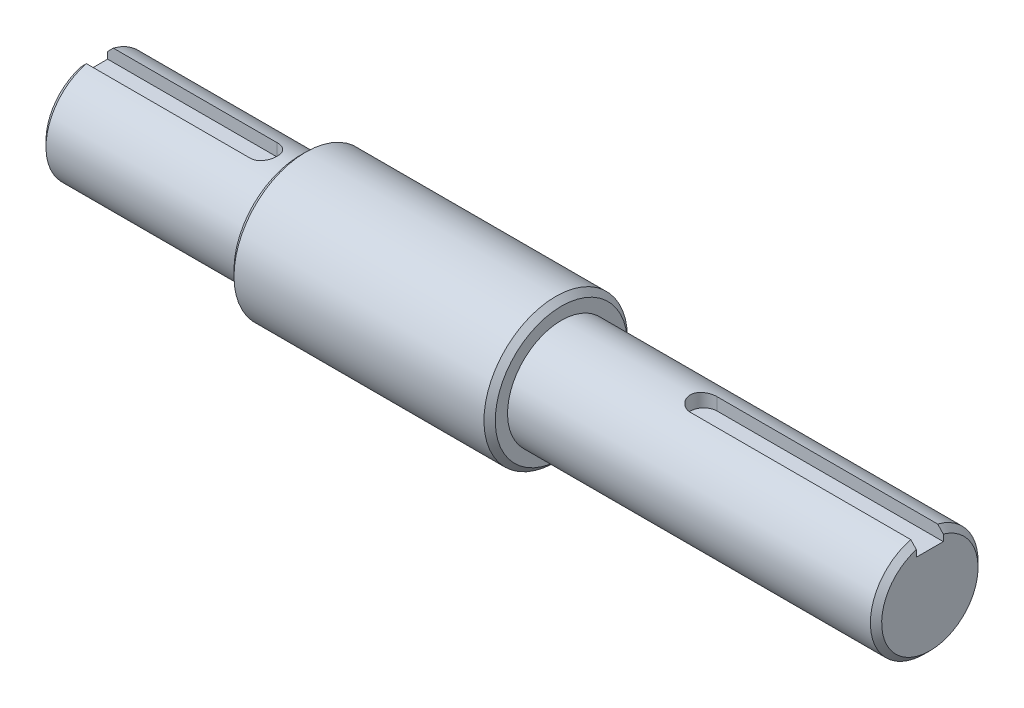
ISO-10303-21;
HEADER;
FILE_DESCRIPTION(('STEP AP214'),'2;1');
FILE_NAME('part.step','',(''),(''),'','','');
FILE_SCHEMA(('AUTOMOTIVE_DESIGN { 1 0 10303 214 1 1 1 1 }'));
ENDSEC;
DATA;
#1=APPLICATION_CONTEXT('core data for automotive mechanical design processes');
#2=APPLICATION_PROTOCOL_DEFINITION('international standard','automotive_design',2000,#1);
#3=PRODUCT_CONTEXT('',#1,'mechanical');
#4=PRODUCT('Part','Part','',(#3));
#5=PRODUCT_RELATED_PRODUCT_CATEGORY('part','',(#4));
#6=PRODUCT_DEFINITION_FORMATION('','',#4);
#7=PRODUCT_DEFINITION_CONTEXT('part definition',#1,'design');
#8=PRODUCT_DEFINITION('design','',#6,#7);
#9=PRODUCT_DEFINITION_SHAPE('','',#8);
#10=(LENGTH_UNIT() NAMED_UNIT(*) SI_UNIT(.MILLI.,.METRE.));
#11=(NAMED_UNIT(*) PLANE_ANGLE_UNIT() SI_UNIT($,.RADIAN.));
#12=(NAMED_UNIT(*) SI_UNIT($,.STERADIAN.) SOLID_ANGLE_UNIT());
#13=UNCERTAINTY_MEASURE_WITH_UNIT(LENGTH_MEASURE(1.E-05),#10,'distance_accuracy_value','');
#14=(GEOMETRIC_REPRESENTATION_CONTEXT(3) GLOBAL_UNCERTAINTY_ASSIGNED_CONTEXT((#13)) GLOBAL_UNIT_ASSIGNED_CONTEXT((#10,
#11,#12)) REPRESENTATION_CONTEXT('',''));
#15=CARTESIAN_POINT('',(0.,0.,0.));
#16=DIRECTION('',(0.,0.,1.));
#17=DIRECTION('',(1.,0.,0.));
#18=AXIS2_PLACEMENT_3D('',#15,#16,#17);
#19=CARTESIAN_POINT('',(-59.557840342124,-12.7,0.));
#20=DIRECTION('',(-1.,0.,0.));
#21=DIRECTION('',(0.,-1.,0.));
#22=AXIS2_PLACEMENT_3D('',#19,#20,#21);
#23=PLANE('',#22);
#24=DIRECTION('',(0.,1.,0.));
#25=VECTOR('',#24,1.);
#26=CARTESIAN_POINT('',(-59.557840342124,-5.67500000000002,-2.38125));
#27=LINE('',#26,#25);
#28=CARTESIAN_POINT('',(-59.557840342124,-5.67500000000002,-2.38125));
#29=VERTEX_POINT('',#28);
#30=CARTESIAN_POINT('',(-59.557840342124,-4.51432510800122,-2.38125));
#31=VERTEX_POINT('',#30);
#32=EDGE_CURVE('E114',#29,#31,#27,.T.);
#33=ORIENTED_EDGE('',*,*,#32,.T.);
#34=CARTESIAN_POINT('',(-59.557840342124,-12.7,0.));
#35=DIRECTION('',(-1.,0.,0.));
#36=DIRECTION('',(0.,-1.,0.));
#37=AXIS2_PLACEMENT_3D('',#34,#35,#36);
#38=CIRCLE('',#37,8.52499999999996);
#39=CARTESIAN_POINT('',(-59.557840342124,-4.51432510800121,2.38125));
#40=VERTEX_POINT('',#39);
#41=EDGE_CURVE('E165',#31,#40,#38,.T.);
#42=ORIENTED_EDGE('',*,*,#41,.T.);
#43=DIRECTION('',(0.,1.,0.));
#44=VECTOR('',#43,1.);
#45=CARTESIAN_POINT('',(-59.557840342124,-5.67500000000002,2.38125));
#46=LINE('',#45,#44);
#47=CARTESIAN_POINT('',(-59.557840342124,-5.67500000000002,2.38125));
#48=VERTEX_POINT('',#47);
#49=EDGE_CURVE('E135',#48,#40,#46,.T.);
#50=ORIENTED_EDGE('',*,*,#49,.F.);
#51=DIRECTION('',(0.,0.,-1.));
#52=VECTOR('',#51,1.);
#53=CARTESIAN_POINT('',(-59.557840342124,-5.67500000000002,0.));
#54=LINE('',#53,#52);
#55=EDGE_CURVE('E131',#48,#29,#54,.T.);
#56=ORIENTED_EDGE('',*,*,#55,.T.);
#57=EDGE_LOOP('',(#33,#42,#50,#56));
#58=FACE_BOUND('',#57,.T.);
#59=ADVANCED_FACE('F33',(#58),#23,.T.);
#60=CARTESIAN_POINT('',(88.3114350212544,-12.7,0.));
#61=DIRECTION('',(1.,0.,0.));
#62=DIRECTION('',(0.,1.,0.));
#63=AXIS2_PLACEMENT_3D('',#60,#61,#62);
#64=CYLINDRICAL_SURFACE('',#63,9.52499999999998);
#65=DIRECTION('',(1.,0.,0.));
#66=VECTOR('',#65,1.);
#67=CARTESIAN_POINT('',(88.3114350212544,-3.4774584068436,2.38125));
#68=LINE('',#67,#66);
#69=CARTESIAN_POINT('',(-58.557840342124,-3.4774584068436,2.38125));
#70=VERTEX_POINT('',#69);
#71=CARTESIAN_POINT('',(-29.557840342124,-3.4774584068436,2.38125));
#72=VERTEX_POINT('',#71);
#73=EDGE_CURVE('E140',#70,#72,#68,.T.);
#74=ORIENTED_EDGE('',*,*,#73,.F.);
#75=CARTESIAN_POINT('',(-58.557840342124,-12.7,0.));
#76=DIRECTION('',(-1.,0.,0.));
#77=DIRECTION('',(0.,0.,1.));
#78=AXIS2_PLACEMENT_3D('',#75,#76,#77);
#79=CIRCLE('',#78,9.52499999999998);
#80=CARTESIAN_POINT('',(-58.557840342124,-3.4774584068436,-2.38125));
#81=VERTEX_POINT('',#80);
#82=EDGE_CURVE('E157',#70,#81,#79,.F.);
#83=ORIENTED_EDGE('',*,*,#82,.T.);
#84=DIRECTION('',(1.,0.,0.));
#85=VECTOR('',#84,1.);
#86=CARTESIAN_POINT('',(88.3114350212544,-3.4774584068436,-2.38125));
#87=LINE('',#86,#85);
#88=CARTESIAN_POINT('',(-29.557840342124,-3.4774584068436,-2.38125));
#89=VERTEX_POINT('',#88);
#90=EDGE_CURVE('E145',#81,#89,#87,.T.);
#91=ORIENTED_EDGE('',*,*,#90,.T.);
#92=CARTESIAN_POINT('',(-29.557840342124,-3.4774584068436,2.38125));
#93=CARTESIAN_POINT('',(-29.491986601769,-3.47746576437919,2.38125762891168));
#94=CARTESIAN_POINT('',(-29.4261373864884,-3.47675322667741,2.37851832615));
#95=CARTESIAN_POINT('',(-29.2949313639576,-3.47394292920292,2.36760511039788));
#96=CARTESIAN_POINT('',(-29.2295744757209,-3.47184540252273,2.35943211189247));
#97=CARTESIAN_POINT('',(-29.0999421614342,-3.4663251195822,2.33773217686751));
#98=CARTESIAN_POINT('',(-29.0356648539693,-3.4629049895767,2.32421584926354));
#99=CARTESIAN_POINT('',(-28.9085317503035,-3.45484761726507,2.29195478238902));
#100=CARTESIAN_POINT('',(-28.845675973664,-3.45021035822123,2.27320997121717));
#101=CARTESIAN_POINT('',(-28.6599089898805,-3.43466702613892,2.20933850925812));
#102=CARTESIAN_POINT('',(-28.5396678961512,-3.42212344311182,2.15655282913113));
#103=CARTESIAN_POINT('',(-28.3097739965468,-3.3940951338733,2.03219018131674));
#104=CARTESIAN_POINT('',(-28.2001240407313,-3.37860961930008,1.96060817472903));
#105=CARTESIAN_POINT('',(-27.9920711302829,-3.3460628830254,1.79899882880256));
#106=CARTESIAN_POINT('',(-27.8939321879695,-3.32897663634539,1.70863600473308));
#107=CARTESIAN_POINT('',(-27.7140315725193,-3.29536966633859,1.5127500688518));
#108=CARTESIAN_POINT('',(-27.6322725172281,-3.27884903375793,1.40722453834541));
#109=CARTESIAN_POINT('',(-27.4863652942111,-3.2479571690118,1.18218809655591));
#110=CARTESIAN_POINT('',(-27.4224786052936,-3.2336191223451,1.06250268224561));
#111=CARTESIAN_POINT('',(-27.3158344283644,-3.20899600232959,0.813679266376078));
#112=CARTESIAN_POINT('',(-27.2730727819852,-3.19871013140945,0.684543130898577));
#113=CARTESIAN_POINT('',(-27.2107399020929,-3.18352725679829,0.423253165723822));
#114=CARTESIAN_POINT('',(-27.1907167069449,-3.17852537171728,0.291213356223301));
#115=CARTESIAN_POINT('',(-27.1730104288601,-3.17410850385425,0.0255574201382496));
#116=CARTESIAN_POINT('',(-27.1753245380112,-3.17469281885851,-0.108058506211415));
#117=CARTESIAN_POINT('',(-27.2019029456848,-3.18130466027498,-0.369933123383242));
#118=CARTESIAN_POINT('',(-27.2256788985809,-3.18721108150792,-0.498244895882252));
#119=CARTESIAN_POINT('',(-27.2937208837485,-3.2036623767059,-0.748995305905367));
#120=CARTESIAN_POINT('',(-27.3379878226014,-3.21420745589779,-0.871433683308658));
#121=CARTESIAN_POINT('',(-27.4461508919055,-3.2389366158009,-1.10825109980906));
#122=CARTESIAN_POINT('',(-27.5102210746904,-3.25315277198345,-1.22254715548046));
#123=CARTESIAN_POINT('',(-27.6560386699905,-3.28368154678096,-1.43893372812636));
#124=CARTESIAN_POINT('',(-27.7377887456512,-3.29999448108603,-1.54102240268539));
#125=CARTESIAN_POINT('',(-27.9192520015313,-3.33345870908536,-1.73300085924058));
#126=CARTESIAN_POINT('',(-28.0193900516377,-3.35062074801748,-1.82248755164686));
#127=CARTESIAN_POINT('',(-28.2334602127424,-3.38345061771976,-1.98350880091301));
#128=CARTESIAN_POINT('',(-28.347396087131,-3.39911803873663,-2.05503844352139));
#129=CARTESIAN_POINT('',(-28.5866370469413,-3.4272264390406,-2.17837871398685));
#130=CARTESIAN_POINT('',(-28.7120000179023,-3.43964960090043,-2.23008114884347));
#131=CARTESIAN_POINT('',(-28.9699500279256,-3.4596294119144,-2.31148497534299));
#132=CARTESIAN_POINT('',(-29.102525947221,-3.46719333390085,-2.3412192568134));
#133=CARTESIAN_POINT('',(-29.289848230051,-3.4737208910058,-2.36673541245283));
#134=CARTESIAN_POINT('',(-29.3433366353842,-3.47512029438905,-2.37217932098802));
#135=CARTESIAN_POINT('',(-29.450488329321,-3.47698863837287,-2.37943252926453));
#136=CARTESIAN_POINT('',(-29.5041511935955,-3.47745908436033,-2.38124770946399));
#137=CARTESIAN_POINT('',(-29.557840342124,-3.4774584068436,-2.38125));
#138=B_SPLINE_CURVE_WITH_KNOTS('',3,(#92,#93,#94,#95,#96,#97,#98,#99,#100,#101,#102,#103,#104,
#105,#106,#107,#108,#109,#110,#111,#112,#113,#114,#115,#116,#117,#118,#119,#120,#121,#122,#123,
#124,#125,#126,#127,#128,#129,#130,#131,#132,#133,#134,#135,#136,#137),.UNSPECIFIED.,.F.,.F.,(4,
2,2,2,2,2,2,2,2,2,2,2,2,2,2,2,2,2,2,2,2,2,4),(0.,0.197492612871571,0.394951996364074,
0.592021287293508,0.789093288422678,1.18284564181806,1.57670365990575,1.97831795708804,
2.37999638945288,2.78727614411439,3.19447569565353,3.59343152992134,3.99233721407388,
4.38238880306292,4.77245765073107,5.16605732012476,5.55971631930075,5.96398847962896,
6.36837115558446,6.77493008767309,7.18087909588358,7.34212308655585,7.50310556421843),.UNSPECIFIED.);
#139=EDGE_CURVE('E195',#72,#89,#138,.T.);
#140=ORIENTED_EDGE('',*,*,#139,.F.);
#141=EDGE_LOOP('',(#74,#83,#91,#140));
#142=FACE_BOUND('',#141,.T.);
#143=CARTESIAN_POINT('',(-23.1143620812544,-12.7,0.));
#144=DIRECTION('',(1.,0.,0.));
#145=DIRECTION('',(0.,1.,0.));
#146=AXIS2_PLACEMENT_3D('',#143,#144,#145);
#147=CIRCLE('',#146,9.52499999999998);
#148=CARTESIAN_POINT('',(-23.1143620812544,-3.17500000000002,0.));
#149=VERTEX_POINT('',#148);
#150=EDGE_CURVE('E253',#149,#149,#147,.T.);
#151=ORIENTED_EDGE('',*,*,#150,.F.);
#152=EDGE_LOOP('',(#151));
#153=FACE_BOUND('',#152,.T.);
#154=ADVANCED_FACE('F209',(#142,#153),#64,.T.);
#155=CARTESIAN_POINT('',(-23.1143620812544,-3.17500000000002,0.));
#156=DIRECTION('',(-1.,0.,0.));
#157=DIRECTION('',(0.,-1.,0.));
#158=AXIS2_PLACEMENT_3D('',#155,#156,#157);
#159=PLANE('',#158);
#160=CARTESIAN_POINT('',(-23.1143620812544,-12.7,0.));
#161=DIRECTION('',(-1.,0.,0.));
#162=DIRECTION('',(0.,-1.,0.));
#163=AXIS2_PLACEMENT_3D('',#160,#161,#162);
#164=CIRCLE('',#163,11.6999999999999);
#165=CARTESIAN_POINT('',(-23.1143620812544,-24.3999999999999,0.));
#166=VERTEX_POINT('',#165);
#167=EDGE_CURVE('E154',#166,#166,#164,.T.);
#168=ORIENTED_EDGE('',*,*,#167,.T.);
#169=EDGE_LOOP('',(#168));
#170=FACE_BOUND('',#169,.T.);
#171=ORIENTED_EDGE('',*,*,#150,.T.);
#172=EDGE_LOOP('',(#171));
#173=FACE_BOUND('',#172,.T.);
#174=ADVANCED_FACE('F213',(#170,#173),#159,.T.);
#175=CARTESIAN_POINT('',(88.3114350212544,-12.7,0.));
#176=DIRECTION('',(1.,0.,0.));
#177=DIRECTION('',(0.,1.,0.));
#178=AXIS2_PLACEMENT_3D('',#175,#176,#177);
#179=CYLINDRICAL_SURFACE('',#178,12.7);
#180=CARTESIAN_POINT('',(22.1143620812544,-12.7,0.));
#181=DIRECTION('',(1.,0.,0.));
#182=DIRECTION('',(0.,0.,-1.));
#183=AXIS2_PLACEMENT_3D('',#180,#181,#182);
#184=CIRCLE('',#183,12.7);
#185=CARTESIAN_POINT('',(22.1143620812544,-12.7,-12.7));
#186=VERTEX_POINT('',#185);
#187=EDGE_CURVE('E151',#186,#186,#184,.F.);
#188=ORIENTED_EDGE('',*,*,#187,.T.);
#189=EDGE_LOOP('',(#188));
#190=FACE_BOUND('',#189,.T.);
#191=CARTESIAN_POINT('',(-22.1143620812544,-12.7,0.));
#192=DIRECTION('',(-1.,0.,0.));
#193=DIRECTION('',(0.,0.,1.));
#194=AXIS2_PLACEMENT_3D('',#191,#192,#193);
#195=CIRCLE('',#194,12.7);
#196=CARTESIAN_POINT('',(-22.1143620812544,-12.7,12.7));
#197=VERTEX_POINT('',#196);
#198=EDGE_CURVE('E143',#197,#197,#195,.F.);
#199=ORIENTED_EDGE('',*,*,#198,.T.);
#200=EDGE_LOOP('',(#199));
#201=FACE_BOUND('',#200,.T.);
#202=ADVANCED_FACE('F229',(#190,#201),#179,.T.);
#203=CARTESIAN_POINT('',(23.1143620812544,0.,0.));
#204=DIRECTION('',(1.,0.,0.));
#205=DIRECTION('',(0.,1.,0.));
#206=AXIS2_PLACEMENT_3D('',#203,#204,#205);
#207=PLANE('',#206);
#208=CARTESIAN_POINT('',(23.1143620812544,-12.7,0.));
#209=DIRECTION('',(1.,0.,0.));
#210=DIRECTION('',(0.,1.,0.));
#211=AXIS2_PLACEMENT_3D('',#208,#209,#210);
#212=CIRCLE('',#211,11.7);
#213=CARTESIAN_POINT('',(23.1143620812544,-1.00000000000001,0.));
#214=VERTEX_POINT('',#213);
#215=EDGE_CURVE('E139',#214,#214,#212,.T.);
#216=ORIENTED_EDGE('',*,*,#215,.T.);
#217=EDGE_LOOP('',(#216));
#218=FACE_BOUND('',#217,.T.);
#219=CARTESIAN_POINT('',(23.1143620812544,-12.7,0.));
#220=DIRECTION('',(1.,0.,0.));
#221=DIRECTION('',(0.,1.,0.));
#222=AXIS2_PLACEMENT_3D('',#219,#220,#221);
#223=CIRCLE('',#222,9.52499999999998);
#224=CARTESIAN_POINT('',(23.1143620812544,-3.17500000000001,0.));
#225=VERTEX_POINT('',#224);
#226=EDGE_CURVE('E250',#225,#225,#223,.T.);
#227=ORIENTED_EDGE('',*,*,#226,.F.);
#228=EDGE_LOOP('',(#227));
#229=FACE_BOUND('',#228,.T.);
#230=ADVANCED_FACE('F226',(#218,#229),#207,.T.);
#231=CARTESIAN_POINT('',(88.3114350212544,-12.7,0.));
#232=DIRECTION('',(1.,0.,0.));
#233=DIRECTION('',(0.,1.,0.));
#234=AXIS2_PLACEMENT_3D('',#231,#232,#233);
#235=CYLINDRICAL_SURFACE('',#234,9.52499999999998);
#236=DIRECTION('',(1.,0.,0.));
#237=VECTOR('',#236,1.);
#238=CARTESIAN_POINT('',(88.3114350212544,-3.4774584068436,-2.38125));
#239=LINE('',#238,#237);
#240=CARTESIAN_POINT('',(48.3114350212544,-3.4774584068436,-2.38125));
#241=VERTEX_POINT('',#240);
#242=CARTESIAN_POINT('',(87.3114350212544,-3.4774584068436,-2.38125));
#243=VERTEX_POINT('',#242);
#244=EDGE_CURVE('E257',#241,#243,#239,.T.);
#245=ORIENTED_EDGE('',*,*,#244,.T.);
#246=CARTESIAN_POINT('',(87.3114350212544,-12.7,0.));
#247=DIRECTION('',(1.,0.,0.));
#248=DIRECTION('',(0.,0.,-1.));
#249=AXIS2_PLACEMENT_3D('',#246,#247,#248);
#250=CIRCLE('',#249,9.52499999999998);
#251=CARTESIAN_POINT('',(87.3114350212544,-3.4774584068436,2.38125));
#252=VERTEX_POINT('',#251);
#253=EDGE_CURVE('E46',#243,#252,#250,.F.);
#254=ORIENTED_EDGE('',*,*,#253,.T.);
#255=DIRECTION('',(1.,0.,0.));
#256=VECTOR('',#255,1.);
#257=CARTESIAN_POINT('',(88.3114350212544,-3.4774584068436,2.38125));
#258=LINE('',#257,#256);
#259=CARTESIAN_POINT('',(48.3114350212544,-3.4774584068436,2.38125));
#260=VERTEX_POINT('',#259);
#261=EDGE_CURVE('E261',#260,#252,#258,.T.);
#262=ORIENTED_EDGE('',*,*,#261,.F.);
#263=CARTESIAN_POINT('',(48.3114350212544,-3.4774584068436,-2.38125));
#264=CARTESIAN_POINT('',(48.2455812808994,-3.4774657643792,-2.38125762891168));
#265=CARTESIAN_POINT('',(48.1797320656188,-3.47675322667742,-2.37851832615));
#266=CARTESIAN_POINT('',(48.048526043088,-3.47394292920292,-2.36760511039788));
#267=CARTESIAN_POINT('',(47.9831691548513,-3.47184540252273,-2.35943211189247));
#268=CARTESIAN_POINT('',(47.8535368405646,-3.4663251195822,-2.33773217686751));
#269=CARTESIAN_POINT('',(47.7892595330997,-3.4629049895767,-2.32421584926354));
#270=CARTESIAN_POINT('',(47.6621264294339,-3.45484761726508,-2.29195478238902));
#271=CARTESIAN_POINT('',(47.5992706527945,-3.45021035822123,-2.27320997121717));
#272=CARTESIAN_POINT('',(47.4135036690109,-3.43466702613892,-2.20933850925812));
#273=CARTESIAN_POINT('',(47.2932625752817,-3.42212344311182,-2.15655282913113));
#274=CARTESIAN_POINT('',(47.0633686756772,-3.3940951338733,-2.03219018131674));
#275=CARTESIAN_POINT('',(46.9537187198617,-3.37860961930008,-1.96060817472903));
#276=CARTESIAN_POINT('',(46.7456658094133,-3.34606288302541,-1.79899882880256));
#277=CARTESIAN_POINT('',(46.6475268671,-3.3289766363454,-1.70863600473308));
#278=CARTESIAN_POINT('',(46.4676262516497,-3.2953696663386,-1.5127500688518));
#279=CARTESIAN_POINT('',(46.3858671963585,-3.27884903375793,-1.40722453834541));
#280=CARTESIAN_POINT('',(46.2399599733415,-3.2479571690118,-1.18218809655591));
#281=CARTESIAN_POINT('',(46.176073284424,-3.23361912234509,-1.06250268224562));
#282=CARTESIAN_POINT('',(46.0694291074948,-3.20899600232959,-0.813679266376082));
#283=CARTESIAN_POINT('',(46.0266674611156,-3.19871013140946,-0.684543130898582));
#284=CARTESIAN_POINT('',(45.9643345812234,-3.1835272567983,-0.423253165723828));
#285=CARTESIAN_POINT('',(45.9443113860753,-3.17852537171728,-0.291213356223307));
#286=CARTESIAN_POINT('',(45.9266051079905,-3.17410850385425,-0.025557420138254));
#287=CARTESIAN_POINT('',(45.9289192171416,-3.17469281885851,0.108058506211411));
#288=CARTESIAN_POINT('',(45.9554976248152,-3.18130466027499,0.369933123383239));
#289=CARTESIAN_POINT('',(45.9792735777114,-3.18721108150792,0.498244895882249));
#290=CARTESIAN_POINT('',(46.0473155628789,-3.2036623767059,0.748995305905364));
#291=CARTESIAN_POINT('',(46.0915825017318,-3.21420745589779,0.871433683308655));
#292=CARTESIAN_POINT('',(46.1997455710359,-3.2389366158009,1.10825109980906));
#293=CARTESIAN_POINT('',(46.2638157538208,-3.25315277198345,1.22254715548046));
#294=CARTESIAN_POINT('',(46.4096333491209,-3.28368154678096,1.43893372812636));
#295=CARTESIAN_POINT('',(46.4913834247816,-3.29999448108603,1.54102240268539));
#296=CARTESIAN_POINT('',(46.6728466806617,-3.33345870908536,1.73300085924058));
#297=CARTESIAN_POINT('',(46.7729847307681,-3.35062074801748,1.82248755164686));
#298=CARTESIAN_POINT('',(46.9870548918728,-3.38345061771976,1.983508800913));
#299=CARTESIAN_POINT('',(47.1009907662615,-3.39911803873663,2.05503844352139));
#300=CARTESIAN_POINT('',(47.3402317260717,-3.4272264390406,2.17837871398685));
#301=CARTESIAN_POINT('',(47.4655946970327,-3.43964960090043,2.23008114884347));
#302=CARTESIAN_POINT('',(47.723544707056,-3.4596294119144,2.31148497534299));
#303=CARTESIAN_POINT('',(47.8561206263514,-3.46719333390086,2.3412192568134));
#304=CARTESIAN_POINT('',(48.0434429091814,-3.4737208910058,2.36673541245283));
#305=CARTESIAN_POINT('',(48.0969313145146,-3.47512029438904,2.37217932098802));
#306=CARTESIAN_POINT('',(48.2040830084514,-3.47698863837287,2.37943252926453));
#307=CARTESIAN_POINT('',(48.257745872726,-3.47745908436033,2.38124770946399));
#308=CARTESIAN_POINT('',(48.3114350212544,-3.4774584068436,2.38125));
#309=B_SPLINE_CURVE_WITH_KNOTS('',3,(#263,#264,#265,#266,#267,#268,#269,#270,#271,#272,#273,
#274,#275,#276,#277,#278,#279,#280,#281,#282,#283,#284,#285,#286,#287,#288,#289,#290,#291,#292,
#293,#294,#295,#296,#297,#298,#299,#300,#301,#302,#303,#304,#305,#306,#307,#308),.UNSPECIFIED.,
.F.,.F.,(4,2,2,2,2,2,2,2,2,2,2,2,2,2,2,2,2,2,2,2,2,2,4),(0.,0.197492612871578,0.394951996364074,
0.592021287293512,0.789093288422674,1.18284564181805,1.57670365990574,1.97831795708803,
2.37999638945287,2.78727614411438,3.19447569565352,3.59343152992134,3.99233721407388,
4.38238880306292,4.77245765073106,5.16605732012475,5.55971631930075,5.96398847962895,
6.36837115558446,6.7749300876731,7.18087909588358,7.34212308655585,7.50310556421843),.UNSPECIFIED.);
#310=EDGE_CURVE('E202',#241,#260,#309,.T.);
#311=ORIENTED_EDGE('',*,*,#310,.F.);
#312=EDGE_LOOP('',(#245,#254,#262,#311));
#313=FACE_BOUND('',#312,.T.);
#314=ORIENTED_EDGE('',*,*,#226,.T.);
#315=EDGE_LOOP('',(#314));
#316=FACE_BOUND('',#315,.T.);
#317=ADVANCED_FACE('F221',(#313,#316),#235,.T.);
#318=CARTESIAN_POINT('',(88.3114350212544,-3.17500000000001,0.));
#319=DIRECTION('',(1.,0.,0.));
#320=DIRECTION('',(0.,1.,0.));
#321=AXIS2_PLACEMENT_3D('',#318,#319,#320);
#322=PLANE('',#321);
#323=DIRECTION('',(0.,1.,0.));
#324=VECTOR('',#323,1.);
#325=CARTESIAN_POINT('',(88.3114350212544,-5.67500000000001,2.38125));
#326=LINE('',#325,#324);
#327=CARTESIAN_POINT('',(88.3114350212544,-5.67500000000001,2.38125));
#328=VERTEX_POINT('',#327);
#329=CARTESIAN_POINT('',(88.3114350212544,-4.51432510800123,2.38125));
#330=VERTEX_POINT('',#329);
#331=EDGE_CURVE('E267',#328,#330,#326,.T.);
#332=ORIENTED_EDGE('',*,*,#331,.T.);
#333=CARTESIAN_POINT('',(88.3114350212544,-12.7,0.));
#334=DIRECTION('',(1.,0.,0.));
#335=DIRECTION('',(0.,1.,0.));
#336=AXIS2_PLACEMENT_3D('',#333,#334,#335);
#337=CIRCLE('',#336,8.52499999999995);
#338=CARTESIAN_POINT('',(88.3114350212544,-4.51432510800123,-2.38125));
#339=VERTEX_POINT('',#338);
#340=EDGE_CURVE('E184',#330,#339,#337,.T.);
#341=ORIENTED_EDGE('',*,*,#340,.T.);
#342=DIRECTION('',(0.,1.,0.));
#343=VECTOR('',#342,1.);
#344=CARTESIAN_POINT('',(88.3114350212544,-5.67500000000001,-2.38125));
#345=LINE('',#344,#343);
#346=CARTESIAN_POINT('',(88.3114350212544,-5.67500000000001,-2.38125));
#347=VERTEX_POINT('',#346);
#348=EDGE_CURVE('E271',#347,#339,#345,.T.);
#349=ORIENTED_EDGE('',*,*,#348,.F.);
#350=DIRECTION('',(0.,0.,1.));
#351=VECTOR('',#350,1.);
#352=CARTESIAN_POINT('',(88.3114350212544,-5.67500000000001,0.));
#353=LINE('',#352,#351);
#354=EDGE_CURVE('E252',#347,#328,#353,.T.);
#355=ORIENTED_EDGE('',*,*,#354,.T.);
#356=EDGE_LOOP('',(#332,#341,#349,#355));
#357=FACE_BOUND('',#356,.T.);
#358=ADVANCED_FACE('F219',(#357),#322,.T.);
#359=CARTESIAN_POINT('',(48.3114350212544,-5.67500000000001,0.));
#360=DIRECTION('',(0.,1.,0.));
#361=DIRECTION('',(-1.,0.,0.));
#362=AXIS2_PLACEMENT_3D('',#359,#360,#361);
#363=CYLINDRICAL_SURFACE('',#362,2.38125);
#364=DIRECTION('',(0.,1.,0.));
#365=VECTOR('',#364,1.);
#366=CARTESIAN_POINT('',(48.3114350212544,-5.67500000000001,-2.38125));
#367=LINE('',#366,#365);
#368=CARTESIAN_POINT('',(48.3114350212544,-5.67500000000001,-2.38125));
#369=VERTEX_POINT('',#368);
#370=EDGE_CURVE('E263',#369,#241,#367,.T.);
#371=ORIENTED_EDGE('',*,*,#370,.T.);
#372=ORIENTED_EDGE('',*,*,#310,.T.);
#373=DIRECTION('',(0.,1.,0.));
#374=VECTOR('',#373,1.);
#375=CARTESIAN_POINT('',(48.3114350212544,-5.67500000000001,2.38125));
#376=LINE('',#375,#374);
#377=CARTESIAN_POINT('',(48.3114350212544,-5.67500000000001,2.38125));
#378=VERTEX_POINT('',#377);
#379=EDGE_CURVE('E264',#378,#260,#376,.T.);
#380=ORIENTED_EDGE('',*,*,#379,.F.);
#381=CARTESIAN_POINT('',(48.3114350212544,-5.67500000000001,0.));
#382=DIRECTION('',(0.,1.,0.));
#383=DIRECTION('',(-1.,0.,0.));
#384=AXIS2_PLACEMENT_3D('',#381,#382,#383);
#385=CIRCLE('',#384,2.38125);
#386=EDGE_CURVE('E279',#369,#378,#385,.T.);
#387=ORIENTED_EDGE('',*,*,#386,.F.);
#388=EDGE_LOOP('',(#371,#372,#380,#387));
#389=FACE_BOUND('',#388,.T.);
#390=ADVANCED_FACE('F215',(#389),#363,.F.);
#391=CARTESIAN_POINT('',(48.3114350212544,-5.67500000000001,-2.38125));
#392=DIRECTION('',(0.,0.,1.));
#393=DIRECTION('',(1.,0.,0.));
#394=AXIS2_PLACEMENT_3D('',#391,#392,#393);
#395=PLANE('',#394);
#396=ORIENTED_EDGE('',*,*,#348,.T.);
#397=CARTESIAN_POINT('',(88.3114350212544,-4.51432510800123,-2.38125));
#398=CARTESIAN_POINT('',(88.1451275788656,-4.34116751943087,-2.38125));
#399=CARTESIAN_POINT('',(87.9786405193389,-4.16818316155418,-2.38125));
#400=CARTESIAN_POINT('',(87.6453071859625,-3.82256092787645,-2.38125));
#401=CARTESIAN_POINT('',(87.4784609121559,-3.64992305203394,-2.38125));
#402=CARTESIAN_POINT('',(87.3114350212544,-3.4774584068436,-2.38125));
#403=B_SPLINE_CURVE_WITH_KNOTS('',3,(#397,#398,#399,#400,#401,#402),.UNSPECIFIED.,.F.,.F.,(4,2,
4),(0.,0.720259509856555,1.44051893348607),.UNSPECIFIED.);
#404=EDGE_CURVE('E60',#339,#243,#403,.T.);
#405=ORIENTED_EDGE('',*,*,#404,.T.);
#406=ORIENTED_EDGE('',*,*,#244,.F.);
#407=ORIENTED_EDGE('',*,*,#370,.F.);
#408=DIRECTION('',(1.,0.,0.));
#409=VECTOR('',#408,1.);
#410=CARTESIAN_POINT('',(48.3114350212544,-5.67500000000001,-2.38125));
#411=LINE('',#410,#409);
#412=EDGE_CURVE('E268',#369,#347,#411,.T.);
#413=ORIENTED_EDGE('',*,*,#412,.T.);
#414=EDGE_LOOP('',(#396,#405,#406,#407,#413));
#415=FACE_BOUND('',#414,.T.);
#416=ADVANCED_FACE('F309',(#415),#395,.T.);
#417=CARTESIAN_POINT('',(48.3114350212544,-5.67500000000001,2.38125));
#418=DIRECTION('',(0.,0.,1.));
#419=DIRECTION('',(1.,0.,0.));
#420=AXIS2_PLACEMENT_3D('',#417,#418,#419);
#421=PLANE('',#420);
#422=ORIENTED_EDGE('',*,*,#261,.T.);
#423=CARTESIAN_POINT('',(87.3114350212544,-3.4774584068436,2.38125));
#424=CARTESIAN_POINT('',(87.4784609121559,-3.64992305203394,2.38125));
#425=CARTESIAN_POINT('',(87.6453071859625,-3.82256092787645,2.38125));
#426=CARTESIAN_POINT('',(87.9786405193389,-4.16818316155418,2.38125));
#427=CARTESIAN_POINT('',(88.1451275788656,-4.34116751943087,2.38125));
#428=CARTESIAN_POINT('',(88.3114350212544,-4.51432510800123,2.38125));
#429=B_SPLINE_CURVE_WITH_KNOTS('',3,(#423,#424,#425,#426,#427,#428),.UNSPECIFIED.,.F.,.F.,(4,2,
4),(0.,0.72025942362952,1.44051893348607),.UNSPECIFIED.);
#430=EDGE_CURVE('E11',#252,#330,#429,.T.);
#431=ORIENTED_EDGE('',*,*,#430,.T.);
#432=ORIENTED_EDGE('',*,*,#331,.F.);
#433=DIRECTION('',(1.,0.,0.));
#434=VECTOR('',#433,1.);
#435=CARTESIAN_POINT('',(48.3114350212544,-5.67500000000001,2.38125));
#436=LINE('',#435,#434);
#437=EDGE_CURVE('E277',#378,#328,#436,.T.);
#438=ORIENTED_EDGE('',*,*,#437,.F.);
#439=ORIENTED_EDGE('',*,*,#379,.T.);
#440=EDGE_LOOP('',(#422,#431,#432,#438,#439));
#441=FACE_BOUND('',#440,.T.);
#442=ADVANCED_FACE('F304',(#441),#421,.F.);
#443=CARTESIAN_POINT('',(48.3114350212544,-5.67500000000001,0.));
#444=DIRECTION('',(0.,1.,0.));
#445=DIRECTION('',(-1.,0.,0.));
#446=AXIS2_PLACEMENT_3D('',#443,#444,#445);
#447=PLANE('',#446);
#448=ORIENTED_EDGE('',*,*,#412,.F.);
#449=ORIENTED_EDGE('',*,*,#386,.T.);
#450=ORIENTED_EDGE('',*,*,#437,.T.);
#451=ORIENTED_EDGE('',*,*,#354,.F.);
#452=EDGE_LOOP('',(#448,#449,#450,#451));
#453=FACE_BOUND('',#452,.T.);
#454=ADVANCED_FACE('F299',(#453),#447,.T.);
#455=CARTESIAN_POINT('',(-59.557840342124,-5.67500000000002,-2.38125));
#456=DIRECTION('',(0.,0.,1.));
#457=DIRECTION('',(1.,0.,0.));
#458=AXIS2_PLACEMENT_3D('',#455,#456,#457);
#459=PLANE('',#458);
#460=ORIENTED_EDGE('',*,*,#90,.F.);
#461=CARTESIAN_POINT('',(-58.557840342124,-3.4774584068436,-2.38125));
#462=CARTESIAN_POINT('',(-58.7248662330255,-3.64992305203394,-2.38125));
#463=CARTESIAN_POINT('',(-58.8917125068321,-3.82256092787645,-2.38125));
#464=CARTESIAN_POINT('',(-59.2250458402085,-4.16818316155417,-2.38125));
#465=CARTESIAN_POINT('',(-59.3915328997352,-4.34116751943087,-2.38125));
#466=CARTESIAN_POINT('',(-59.557840342124,-4.51432510800122,-2.38125));
#467=B_SPLINE_CURVE_WITH_KNOTS('',3,(#461,#462,#463,#464,#465,#466),.UNSPECIFIED.,.F.,.F.,(4,2,
4),(0.,0.720259423629504,1.44051893348605),.UNSPECIFIED.);
#468=EDGE_CURVE('E121',#81,#31,#467,.T.);
#469=ORIENTED_EDGE('',*,*,#468,.T.);
#470=ORIENTED_EDGE('',*,*,#32,.F.);
#471=DIRECTION('',(1.,0.,0.));
#472=VECTOR('',#471,1.);
#473=CARTESIAN_POINT('',(-59.557840342124,-5.67500000000002,-2.38125));
#474=LINE('',#473,#472);
#475=CARTESIAN_POINT('',(-29.557840342124,-5.67500000000002,-2.38125));
#476=VERTEX_POINT('',#475);
#477=EDGE_CURVE('E119',#29,#476,#474,.T.);
#478=ORIENTED_EDGE('',*,*,#477,.T.);
#479=DIRECTION('',(0.,1.,0.));
#480=VECTOR('',#479,1.);
#481=CARTESIAN_POINT('',(-29.557840342124,-5.67500000000002,-2.38125));
#482=LINE('',#481,#480);
#483=EDGE_CURVE('E125',#476,#89,#482,.T.);
#484=ORIENTED_EDGE('',*,*,#483,.T.);
#485=EDGE_LOOP('',(#460,#469,#470,#478,#484));
#486=FACE_BOUND('',#485,.T.);
#487=ADVANCED_FACE('F117',(#486),#459,.T.);
#488=CARTESIAN_POINT('',(-29.557840342124,-5.67500000000002,0.));
#489=DIRECTION('',(0.,1.,0.));
#490=DIRECTION('',(-1.,0.,0.));
#491=AXIS2_PLACEMENT_3D('',#488,#489,#490);
#492=CYLINDRICAL_SURFACE('',#491,2.38125);
#493=DIRECTION('',(0.,1.,0.));
#494=VECTOR('',#493,1.);
#495=CARTESIAN_POINT('',(-29.557840342124,-5.67500000000002,2.38125));
#496=LINE('',#495,#494);
#497=CARTESIAN_POINT('',(-29.557840342124,-5.67500000000002,2.38125));
#498=VERTEX_POINT('',#497);
#499=EDGE_CURVE('E286',#498,#72,#496,.T.);
#500=ORIENTED_EDGE('',*,*,#499,.T.);
#501=ORIENTED_EDGE('',*,*,#139,.T.);
#502=ORIENTED_EDGE('',*,*,#483,.F.);
#503=CARTESIAN_POINT('',(-29.557840342124,-5.67500000000002,0.));
#504=DIRECTION('',(0.,1.,0.));
#505=DIRECTION('',(-1.,0.,0.));
#506=AXIS2_PLACEMENT_3D('',#503,#504,#505);
#507=CIRCLE('',#506,2.38125);
#508=EDGE_CURVE('E134',#498,#476,#507,.T.);
#509=ORIENTED_EDGE('',*,*,#508,.F.);
#510=EDGE_LOOP('',(#500,#501,#502,#509));
#511=FACE_BOUND('',#510,.T.);
#512=ADVANCED_FACE('F189',(#511),#492,.F.);
#513=CARTESIAN_POINT('',(-59.557840342124,-5.67500000000002,2.38125));
#514=DIRECTION('',(0.,0.,1.));
#515=DIRECTION('',(1.,0.,0.));
#516=AXIS2_PLACEMENT_3D('',#513,#514,#515);
#517=PLANE('',#516);
#518=ORIENTED_EDGE('',*,*,#49,.T.);
#519=CARTESIAN_POINT('',(-59.557840342124,-4.51432510800122,2.38125));
#520=CARTESIAN_POINT('',(-59.3915328997352,-4.34116751943087,2.38125));
#521=CARTESIAN_POINT('',(-59.2250458402084,-4.16818316155417,2.38125));
#522=CARTESIAN_POINT('',(-58.8917125068321,-3.82256092787645,2.38125));
#523=CARTESIAN_POINT('',(-58.7248662330255,-3.64992305203394,2.38125));
#524=CARTESIAN_POINT('',(-58.557840342124,-3.4774584068436,2.38125));
#525=B_SPLINE_CURVE_WITH_KNOTS('',3,(#519,#520,#521,#522,#523,#524),.UNSPECIFIED.,.F.,.F.,(4,2,
4),(0.,0.720259509856541,1.44051893348605),.UNSPECIFIED.);
#526=EDGE_CURVE('E178',#40,#70,#525,.T.);
#527=ORIENTED_EDGE('',*,*,#526,.T.);
#528=ORIENTED_EDGE('',*,*,#73,.T.);
#529=ORIENTED_EDGE('',*,*,#499,.F.);
#530=DIRECTION('',(1.,0.,0.));
#531=VECTOR('',#530,1.);
#532=CARTESIAN_POINT('',(-59.557840342124,-5.67500000000002,2.38125));
#533=LINE('',#532,#531);
#534=EDGE_CURVE('E282',#48,#498,#533,.T.);
#535=ORIENTED_EDGE('',*,*,#534,.F.);
#536=EDGE_LOOP('',(#518,#527,#528,#529,#535));
#537=FACE_BOUND('',#536,.T.);
#538=ADVANCED_FACE('F186',(#537),#517,.F.);
#539=CARTESIAN_POINT('',(-59.557840342124,-5.67500000000002,0.));
#540=DIRECTION('',(0.,1.,0.));
#541=DIRECTION('',(-1.,0.,0.));
#542=AXIS2_PLACEMENT_3D('',#539,#540,#541);
#543=PLANE('',#542);
#544=ORIENTED_EDGE('',*,*,#534,.T.);
#545=ORIENTED_EDGE('',*,*,#508,.T.);
#546=ORIENTED_EDGE('',*,*,#477,.F.);
#547=ORIENTED_EDGE('',*,*,#55,.F.);
#548=EDGE_LOOP('',(#544,#545,#546,#547));
#549=FACE_BOUND('',#548,.T.);
#550=ADVANCED_FACE('F130',(#549),#543,.T.);
#551=CARTESIAN_POINT('',(23.1143620812544,-12.7,0.));
#552=DIRECTION('',(-1.,0.,0.));
#553=DIRECTION('',(0.,0.,1.));
#554=AXIS2_PLACEMENT_3D('',#551,#552,#553);
#555=CONICAL_SURFACE('',#554,11.7,0.785398163397447);
#556=ORIENTED_EDGE('',*,*,#187,.F.);
#557=EDGE_LOOP('',(#556));
#558=FACE_BOUND('',#557,.T.);
#559=ORIENTED_EDGE('',*,*,#215,.F.);
#560=EDGE_LOOP('',(#559));
#561=FACE_BOUND('',#560,.T.);
#562=ADVANCED_FACE('F236',(#558,#561),#555,.T.);
#563=CARTESIAN_POINT('',(-22.1143620812544,-12.7,0.));
#564=DIRECTION('',(1.,0.,0.));
#565=DIRECTION('',(0.,0.,-1.));
#566=AXIS2_PLACEMENT_3D('',#563,#564,#565);
#567=CONICAL_SURFACE('',#566,12.7,0.785398163397459);
#568=ORIENTED_EDGE('',*,*,#167,.F.);
#569=EDGE_LOOP('',(#568));
#570=FACE_BOUND('',#569,.T.);
#571=ORIENTED_EDGE('',*,*,#198,.F.);
#572=EDGE_LOOP('',(#571));
#573=FACE_BOUND('',#572,.T.);
#574=ADVANCED_FACE('F174',(#570,#573),#567,.T.);
#575=CARTESIAN_POINT('',(-58.557840342124,-12.7,0.));
#576=DIRECTION('',(1.,0.,0.));
#577=DIRECTION('',(0.,0.,-1.));
#578=AXIS2_PLACEMENT_3D('',#575,#576,#577);
#579=CONICAL_SURFACE('',#578,9.52499999999998,0.785398163397459);
#580=ORIENTED_EDGE('',*,*,#526,.F.);
#581=ORIENTED_EDGE('',*,*,#41,.F.);
#582=ORIENTED_EDGE('',*,*,#468,.F.);
#583=ORIENTED_EDGE('',*,*,#82,.F.);
#584=EDGE_LOOP('',(#580,#581,#582,#583));
#585=FACE_BOUND('',#584,.T.);
#586=ADVANCED_FACE('F170',(#585),#579,.T.);
#587=CARTESIAN_POINT('',(88.3114350212544,-12.7,0.));
#588=DIRECTION('',(-1.,0.,0.));
#589=DIRECTION('',(0.,0.,1.));
#590=AXIS2_PLACEMENT_3D('',#587,#588,#589);
#591=CONICAL_SURFACE('',#590,8.52499999999995,0.785398163397445);
#592=ORIENTED_EDGE('',*,*,#430,.F.);
#593=ORIENTED_EDGE('',*,*,#253,.F.);
#594=ORIENTED_EDGE('',*,*,#404,.F.);
#595=ORIENTED_EDGE('',*,*,#340,.F.);
#596=EDGE_LOOP('',(#592,#593,#594,#595));
#597=FACE_BOUND('',#596,.T.);
#598=ADVANCED_FACE('F35',(#597),#591,.T.);
#599=CLOSED_SHELL('',(#59,#154,#174,#202,#230,#317,#358,#390,#416,#442,#454,#487,#512,#538,#550,
#562,#574,#586,#598));
#600=MANIFOLD_SOLID_BREP('B2',#599);
#601=ADVANCED_BREP_SHAPE_REPRESENTATION('',(#18,#600),#14);
#602=SHAPE_DEFINITION_REPRESENTATION(#9,#601);
ENDSEC;
END-ISO-10303-21;
